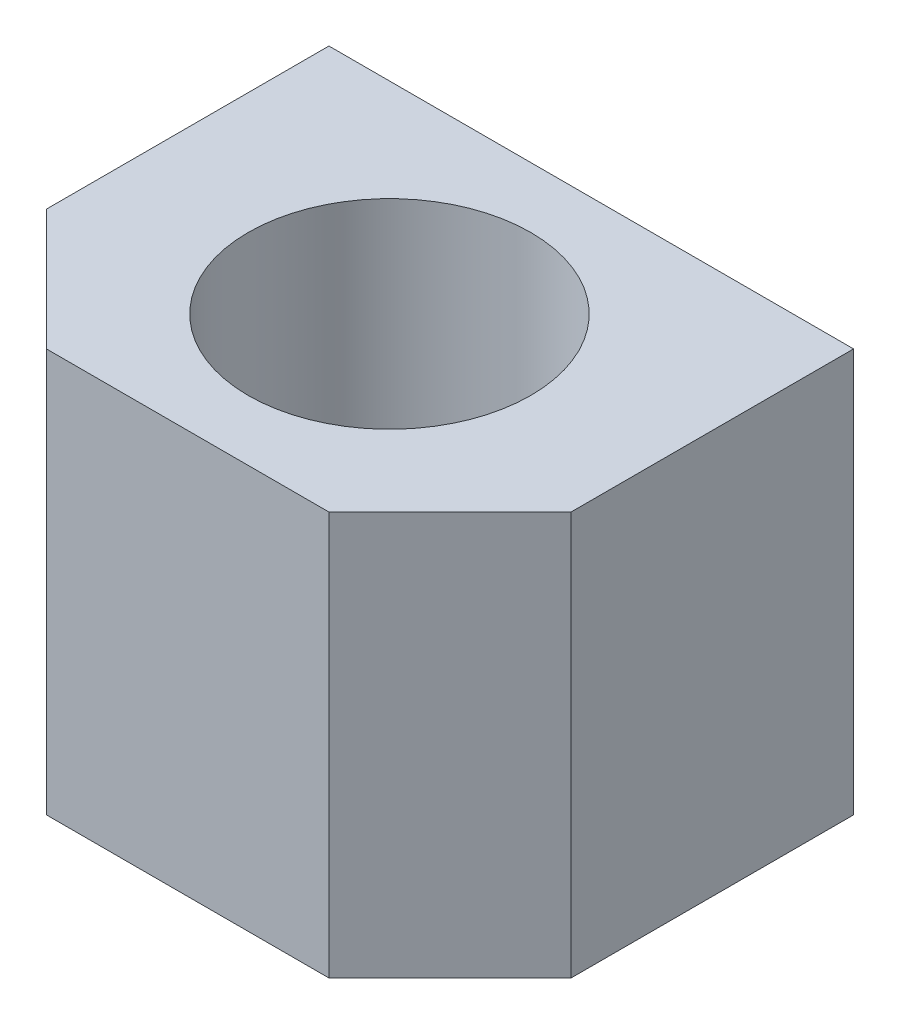
ISO-10303-21;
HEADER;
FILE_DESCRIPTION(('STEP AP214'),'2;1');
FILE_NAME('part.step','',(''),(''),'','','');
FILE_SCHEMA(('AUTOMOTIVE_DESIGN { 1 0 10303 214 1 1 1 1 }'));
ENDSEC;
DATA;
#1=APPLICATION_CONTEXT('core data for automotive mechanical design processes');
#2=APPLICATION_PROTOCOL_DEFINITION('international standard','automotive_design',2000,#1);
#3=PRODUCT_CONTEXT('',#1,'mechanical');
#4=PRODUCT('Part','Part','',(#3));
#5=PRODUCT_RELATED_PRODUCT_CATEGORY('part','',(#4));
#6=PRODUCT_DEFINITION_FORMATION('','',#4);
#7=PRODUCT_DEFINITION_CONTEXT('part definition',#1,'design');
#8=PRODUCT_DEFINITION('design','',#6,#7);
#9=PRODUCT_DEFINITION_SHAPE('','',#8);
#10=(LENGTH_UNIT() NAMED_UNIT(*) SI_UNIT(.MILLI.,.METRE.));
#11=(NAMED_UNIT(*) PLANE_ANGLE_UNIT() SI_UNIT($,.RADIAN.));
#12=(NAMED_UNIT(*) SI_UNIT($,.STERADIAN.) SOLID_ANGLE_UNIT());
#13=UNCERTAINTY_MEASURE_WITH_UNIT(LENGTH_MEASURE(1.E-05),#10,'distance_accuracy_value','');
#14=(GEOMETRIC_REPRESENTATION_CONTEXT(3) GLOBAL_UNCERTAINTY_ASSIGNED_CONTEXT((#13)) GLOBAL_UNIT_ASSIGNED_CONTEXT((#10,
#11,#12)) REPRESENTATION_CONTEXT('',''));
#15=CARTESIAN_POINT('',(0.,0.,0.));
#16=DIRECTION('',(0.,0.,1.));
#17=DIRECTION('',(1.,0.,0.));
#18=AXIS2_PLACEMENT_3D('',#15,#16,#17);
#19=CARTESIAN_POINT('',(0.,0.,0.));
#20=DIRECTION('',(0.,1.,0.));
#21=DIRECTION('',(1.,0.,0.));
#22=AXIS2_PLACEMENT_3D('',#19,#20,#21);
#23=PLANE('',#22);
#24=CARTESIAN_POINT('',(0.,0.,0.));
#25=DIRECTION('',(0.,-1.,0.));
#26=DIRECTION('',(1.,0.,0.));
#27=AXIS2_PLACEMENT_3D('',#24,#25,#26);
#28=CIRCLE('',#27,14.);
#29=CARTESIAN_POINT('',(-14.,0.,0.));
#30=VERTEX_POINT('',#29);
#31=EDGE_CURVE('E229',#30,#30,#28,.T.);
#32=ORIENTED_EDGE('',*,*,#31,.F.);
#33=EDGE_LOOP('',(#32));
#34=FACE_BOUND('',#33,.T.);
#35=CARTESIAN_POINT('',(-13.4965451986757,0.,-13.4965451986758));
#36=DIRECTION('',(0.,1.,0.));
#37=DIRECTION('',(0.,0.,-1.));
#38=AXIS2_PLACEMENT_3D('',#35,#36,#37);
#39=CIRCLE('',#38,2.117);
#40=CARTESIAN_POINT('',(-13.4965451986757,0.,-11.3795451986758));
#41=VERTEX_POINT('',#40);
#42=EDGE_CURVE('E207',#41,#41,#39,.T.);
#43=ORIENTED_EDGE('',*,*,#42,.T.);
#44=EDGE_LOOP('',(#43));
#45=FACE_BOUND('',#44,.T.);
#46=CARTESIAN_POINT('',(-13.4350288425444,0.,13.4350288425444));
#47=DIRECTION('',(0.,1.,0.));
#48=DIRECTION('',(0.,0.,-1.));
#49=AXIS2_PLACEMENT_3D('',#46,#47,#48);
#50=CIRCLE('',#49,2.117);
#51=CARTESIAN_POINT('',(-13.4350288425444,0.,15.5520288425444));
#52=VERTEX_POINT('',#51);
#53=EDGE_CURVE('E203',#52,#52,#50,.T.);
#54=ORIENTED_EDGE('',*,*,#53,.T.);
#55=EDGE_LOOP('',(#54));
#56=FACE_BOUND('',#55,.T.);
#57=CARTESIAN_POINT('',(-19.,0.,0.));
#58=DIRECTION('',(0.,1.,0.));
#59=DIRECTION('',(0.,0.,-1.));
#60=AXIS2_PLACEMENT_3D('',#57,#58,#59);
#61=CIRCLE('',#60,2.117);
#62=CARTESIAN_POINT('',(-19.,0.,2.117));
#63=VERTEX_POINT('',#62);
#64=EDGE_CURVE('E305',#63,#63,#61,.T.);
#65=ORIENTED_EDGE('',*,*,#64,.T.);
#66=EDGE_LOOP('',(#65));
#67=FACE_BOUND('',#66,.T.);
#68=CARTESIAN_POINT('',(13.4965451986757,0.,-13.4965451986758));
#69=DIRECTION('',(0.,1.,0.));
#70=DIRECTION('',(0.,0.,-1.));
#71=AXIS2_PLACEMENT_3D('',#68,#69,#70);
#72=CIRCLE('',#71,2.117);
#73=CARTESIAN_POINT('',(13.4965451986757,0.,-11.3795451986758));
#74=VERTEX_POINT('',#73);
#75=EDGE_CURVE('E327',#74,#74,#72,.T.);
#76=ORIENTED_EDGE('',*,*,#75,.T.);
#77=EDGE_LOOP('',(#76));
#78=FACE_BOUND('',#77,.T.);
#79=CARTESIAN_POINT('',(13.4350288425444,0.,13.4350288425444));
#80=DIRECTION('',(0.,1.,0.));
#81=DIRECTION('',(0.,0.,-1.));
#82=AXIS2_PLACEMENT_3D('',#79,#80,#81);
#83=CIRCLE('',#82,2.117);
#84=CARTESIAN_POINT('',(13.4350288425444,0.,15.5520288425444));
#85=VERTEX_POINT('',#84);
#86=EDGE_CURVE('E335',#85,#85,#83,.T.);
#87=ORIENTED_EDGE('',*,*,#86,.T.);
#88=EDGE_LOOP('',(#87));
#89=FACE_BOUND('',#88,.T.);
#90=CARTESIAN_POINT('',(19.,0.,0.));
#91=DIRECTION('',(0.,1.,0.));
#92=DIRECTION('',(0.,0.,-1.));
#93=AXIS2_PLACEMENT_3D('',#90,#91,#92);
#94=CIRCLE('',#93,2.117);
#95=CARTESIAN_POINT('',(19.,0.,2.117));
#96=VERTEX_POINT('',#95);
#97=EDGE_CURVE('E336',#96,#96,#94,.T.);
#98=ORIENTED_EDGE('',*,*,#97,.T.);
#99=EDGE_LOOP('',(#98));
#100=FACE_BOUND('',#99,.T.);
#101=DIRECTION('',(0.707106781186548,0.,-0.707106781186547));
#102=VECTOR('',#101,1.);
#103=CARTESIAN_POINT('',(14.,0.,20.));
#104=LINE('',#103,#102);
#105=CARTESIAN_POINT('',(14.,0.,20.));
#106=VERTEX_POINT('',#105);
#107=CARTESIAN_POINT('',(26.,0.,8.));
#108=VERTEX_POINT('',#107);
#109=EDGE_CURVE('E25',#106,#108,#104,.T.);
#110=ORIENTED_EDGE('',*,*,#109,.F.);
#111=DIRECTION('',(1.,0.,0.));
#112=VECTOR('',#111,1.);
#113=CARTESIAN_POINT('',(-26.,0.,20.));
#114=LINE('',#113,#112);
#115=CARTESIAN_POINT('',(-14.,0.,20.));
#116=VERTEX_POINT('',#115);
#117=EDGE_CURVE('E231',#116,#106,#114,.T.);
#118=ORIENTED_EDGE('',*,*,#117,.F.);
#119=DIRECTION('',(0.707106781186548,0.,0.707106781186547));
#120=VECTOR('',#119,1.);
#121=CARTESIAN_POINT('',(-26.,0.,8.));
#122=LINE('',#121,#120);
#123=CARTESIAN_POINT('',(-26.,0.,8.));
#124=VERTEX_POINT('',#123);
#125=EDGE_CURVE('E251',#124,#116,#122,.T.);
#126=ORIENTED_EDGE('',*,*,#125,.F.);
#127=DIRECTION('',(0.,0.,1.));
#128=VECTOR('',#127,1.);
#129=CARTESIAN_POINT('',(-26.,0.,-20.));
#130=LINE('',#129,#128);
#131=CARTESIAN_POINT('',(-26.,0.,-20.));
#132=VERTEX_POINT('',#131);
#133=EDGE_CURVE('E239',#132,#124,#130,.T.);
#134=ORIENTED_EDGE('',*,*,#133,.F.);
#135=DIRECTION('',(-1.,0.,0.));
#136=VECTOR('',#135,1.);
#137=CARTESIAN_POINT('',(26.,0.,-20.));
#138=LINE('',#137,#136);
#139=CARTESIAN_POINT('',(26.,0.,-20.));
#140=VERTEX_POINT('',#139);
#141=EDGE_CURVE('E270',#140,#132,#138,.T.);
#142=ORIENTED_EDGE('',*,*,#141,.F.);
#143=DIRECTION('',(0.,0.,-1.));
#144=VECTOR('',#143,1.);
#145=CARTESIAN_POINT('',(26.,0.,20.));
#146=LINE('',#145,#144);
#147=EDGE_CURVE('E280',#108,#140,#146,.T.);
#148=ORIENTED_EDGE('',*,*,#147,.F.);
#149=EDGE_LOOP('',(#110,#118,#126,#134,#142,#148));
#150=FACE_BOUND('',#149,.T.);
#151=ADVANCED_FACE('F17',(#34,#45,#56,#67,#78,#89,#100,#150),#23,.F.);
#152=CARTESIAN_POINT('',(0.,40.,0.));
#153=DIRECTION('',(0.,1.,0.));
#154=DIRECTION('',(1.,0.,0.));
#155=AXIS2_PLACEMENT_3D('',#152,#153,#154);
#156=PLANE('',#155);
#157=CARTESIAN_POINT('',(0.,40.,0.));
#158=DIRECTION('',(0.,-1.,0.));
#159=DIRECTION('',(1.,0.,0.));
#160=AXIS2_PLACEMENT_3D('',#157,#158,#159);
#161=CIRCLE('',#160,14.);
#162=CARTESIAN_POINT('',(-14.,40.,0.));
#163=VERTEX_POINT('',#162);
#164=EDGE_CURVE('E219',#163,#163,#161,.T.);
#165=ORIENTED_EDGE('',*,*,#164,.T.);
#166=EDGE_LOOP('',(#165));
#167=FACE_BOUND('',#166,.T.);
#168=DIRECTION('',(0.707106781186548,0.,-0.707106781186547));
#169=VECTOR('',#168,1.);
#170=CARTESIAN_POINT('',(14.,40.,20.));
#171=LINE('',#170,#169);
#172=CARTESIAN_POINT('',(14.,40.,20.));
#173=VERTEX_POINT('',#172);
#174=CARTESIAN_POINT('',(26.,40.,8.));
#175=VERTEX_POINT('',#174);
#176=EDGE_CURVE('E11',#173,#175,#171,.T.);
#177=ORIENTED_EDGE('',*,*,#176,.T.);
#178=DIRECTION('',(0.,0.,-1.));
#179=VECTOR('',#178,1.);
#180=CARTESIAN_POINT('',(26.,40.,20.));
#181=LINE('',#180,#179);
#182=CARTESIAN_POINT('',(26.,40.,-20.));
#183=VERTEX_POINT('',#182);
#184=EDGE_CURVE('E278',#175,#183,#181,.T.);
#185=ORIENTED_EDGE('',*,*,#184,.T.);
#186=DIRECTION('',(-1.,0.,0.));
#187=VECTOR('',#186,1.);
#188=CARTESIAN_POINT('',(26.,40.,-20.));
#189=LINE('',#188,#187);
#190=CARTESIAN_POINT('',(-26.,40.,-20.));
#191=VERTEX_POINT('',#190);
#192=EDGE_CURVE('E269',#183,#191,#189,.T.);
#193=ORIENTED_EDGE('',*,*,#192,.T.);
#194=DIRECTION('',(0.,0.,1.));
#195=VECTOR('',#194,1.);
#196=CARTESIAN_POINT('',(-26.,40.,-20.));
#197=LINE('',#196,#195);
#198=CARTESIAN_POINT('',(-26.,40.,8.));
#199=VERTEX_POINT('',#198);
#200=EDGE_CURVE('E257',#191,#199,#197,.T.);
#201=ORIENTED_EDGE('',*,*,#200,.T.);
#202=DIRECTION('',(0.707106781186548,0.,0.707106781186547));
#203=VECTOR('',#202,1.);
#204=CARTESIAN_POINT('',(-26.,40.,8.));
#205=LINE('',#204,#203);
#206=CARTESIAN_POINT('',(-14.,40.,20.));
#207=VERTEX_POINT('',#206);
#208=EDGE_CURVE('E241',#199,#207,#205,.T.);
#209=ORIENTED_EDGE('',*,*,#208,.T.);
#210=DIRECTION('',(1.,0.,0.));
#211=VECTOR('',#210,1.);
#212=CARTESIAN_POINT('',(-26.,40.,20.));
#213=LINE('',#212,#211);
#214=EDGE_CURVE('E244',#207,#173,#213,.T.);
#215=ORIENTED_EDGE('',*,*,#214,.T.);
#216=EDGE_LOOP('',(#177,#185,#193,#201,#209,#215));
#217=FACE_BOUND('',#216,.T.);
#218=ADVANCED_FACE('F323',(#167,#217),#156,.T.);
#219=CARTESIAN_POINT('',(14.,0.,20.));
#220=DIRECTION('',(0.707106781186547,0.,0.707106781186548));
#221=DIRECTION('',(0.,-1.,0.));
#222=AXIS2_PLACEMENT_3D('',#219,#220,#221);
#223=PLANE('',#222);
#224=ORIENTED_EDGE('',*,*,#109,.T.);
#225=DIRECTION('',(0.,1.,0.));
#226=VECTOR('',#225,1.);
#227=CARTESIAN_POINT('',(26.,0.,8.));
#228=LINE('',#227,#226);
#229=EDGE_CURVE('E282',#108,#175,#228,.T.);
#230=ORIENTED_EDGE('',*,*,#229,.T.);
#231=ORIENTED_EDGE('',*,*,#176,.F.);
#232=DIRECTION('',(0.,1.,0.));
#233=VECTOR('',#232,1.);
#234=CARTESIAN_POINT('',(14.,0.,20.));
#235=LINE('',#234,#233);
#236=EDGE_CURVE('E234',#106,#173,#235,.T.);
#237=ORIENTED_EDGE('',*,*,#236,.F.);
#238=EDGE_LOOP('',(#224,#230,#231,#237));
#239=FACE_BOUND('',#238,.T.);
#240=ADVANCED_FACE('F341',(#239),#223,.T.);
#241=CARTESIAN_POINT('',(26.,0.,8.));
#242=DIRECTION('',(1.,0.,0.));
#243=DIRECTION('',(0.,1.,0.));
#244=AXIS2_PLACEMENT_3D('',#241,#242,#243);
#245=PLANE('',#244);
#246=ORIENTED_EDGE('',*,*,#147,.T.);
#247=DIRECTION('',(0.,1.,0.));
#248=VECTOR('',#247,1.);
#249=CARTESIAN_POINT('',(26.,0.,-20.));
#250=LINE('',#249,#248);
#251=EDGE_CURVE('E272',#140,#183,#250,.T.);
#252=ORIENTED_EDGE('',*,*,#251,.T.);
#253=ORIENTED_EDGE('',*,*,#184,.F.);
#254=ORIENTED_EDGE('',*,*,#229,.F.);
#255=EDGE_LOOP('',(#246,#252,#253,#254));
#256=FACE_BOUND('',#255,.T.);
#257=ADVANCED_FACE('F359',(#256),#245,.T.);
#258=CARTESIAN_POINT('',(26.,0.,-20.));
#259=DIRECTION('',(0.,0.,-1.));
#260=DIRECTION('',(0.,-1.,0.));
#261=AXIS2_PLACEMENT_3D('',#258,#259,#260);
#262=PLANE('',#261);
#263=CARTESIAN_POINT('',(20.,8.,-20.));
#264=DIRECTION('',(0.,0.,1.));
#265=DIRECTION('',(-1.,0.,0.));
#266=AXIS2_PLACEMENT_3D('',#263,#264,#265);
#267=CIRCLE('',#266,2.117);
#268=CARTESIAN_POINT('',(22.117,8.,-20.));
#269=VERTEX_POINT('',#268);
#270=EDGE_CURVE('E667',#269,#269,#267,.T.);
#271=ORIENTED_EDGE('',*,*,#270,.T.);
#272=EDGE_LOOP('',(#271));
#273=FACE_BOUND('',#272,.T.);
#274=CARTESIAN_POINT('',(-20.,32.,-20.));
#275=DIRECTION('',(0.,0.,1.));
#276=DIRECTION('',(-1.,0.,0.));
#277=AXIS2_PLACEMENT_3D('',#274,#275,#276);
#278=CIRCLE('',#277,2.117);
#279=CARTESIAN_POINT('',(-17.883,32.,-20.));
#280=VERTEX_POINT('',#279);
#281=EDGE_CURVE('E672',#280,#280,#278,.T.);
#282=ORIENTED_EDGE('',*,*,#281,.T.);
#283=EDGE_LOOP('',(#282));
#284=FACE_BOUND('',#283,.T.);
#285=CARTESIAN_POINT('',(-20.,8.,-20.));
#286=DIRECTION('',(0.,0.,1.));
#287=DIRECTION('',(-1.,0.,0.));
#288=AXIS2_PLACEMENT_3D('',#285,#286,#287);
#289=CIRCLE('',#288,2.117);
#290=CARTESIAN_POINT('',(-17.883,8.,-20.));
#291=VERTEX_POINT('',#290);
#292=EDGE_CURVE('E653',#291,#291,#289,.T.);
#293=ORIENTED_EDGE('',*,*,#292,.T.);
#294=EDGE_LOOP('',(#293));
#295=FACE_BOUND('',#294,.T.);
#296=CARTESIAN_POINT('',(20.,32.,-20.));
#297=DIRECTION('',(0.,0.,1.));
#298=DIRECTION('',(-1.,0.,0.));
#299=AXIS2_PLACEMENT_3D('',#296,#297,#298);
#300=CIRCLE('',#299,2.117);
#301=CARTESIAN_POINT('',(22.117,32.,-20.));
#302=VERTEX_POINT('',#301);
#303=EDGE_CURVE('E639',#302,#302,#300,.T.);
#304=ORIENTED_EDGE('',*,*,#303,.T.);
#305=EDGE_LOOP('',(#304));
#306=FACE_BOUND('',#305,.T.);
#307=ORIENTED_EDGE('',*,*,#141,.T.);
#308=DIRECTION('',(0.,1.,0.));
#309=VECTOR('',#308,1.);
#310=CARTESIAN_POINT('',(-26.,0.,-20.));
#311=LINE('',#310,#309);
#312=EDGE_CURVE('E263',#132,#191,#311,.T.);
#313=ORIENTED_EDGE('',*,*,#312,.T.);
#314=ORIENTED_EDGE('',*,*,#192,.F.);
#315=ORIENTED_EDGE('',*,*,#251,.F.);
#316=EDGE_LOOP('',(#307,#313,#314,#315));
#317=FACE_BOUND('',#316,.T.);
#318=ADVANCED_FACE('F360',(#273,#284,#295,#306,#317),#262,.T.);
#319=CARTESIAN_POINT('',(-26.,0.,-20.));
#320=DIRECTION('',(-1.,0.,0.));
#321=DIRECTION('',(0.,0.,1.));
#322=AXIS2_PLACEMENT_3D('',#319,#320,#321);
#323=PLANE('',#322);
#324=ORIENTED_EDGE('',*,*,#133,.T.);
#325=DIRECTION('',(0.,1.,0.));
#326=VECTOR('',#325,1.);
#327=CARTESIAN_POINT('',(-26.,0.,8.));
#328=LINE('',#327,#326);
#329=EDGE_CURVE('E240',#124,#199,#328,.T.);
#330=ORIENTED_EDGE('',*,*,#329,.T.);
#331=ORIENTED_EDGE('',*,*,#200,.F.);
#332=ORIENTED_EDGE('',*,*,#312,.F.);
#333=EDGE_LOOP('',(#324,#330,#331,#332));
#334=FACE_BOUND('',#333,.T.);
#335=ADVANCED_FACE('F352',(#334),#323,.T.);
#336=CARTESIAN_POINT('',(-26.,0.,8.));
#337=DIRECTION('',(-0.707106781186547,0.,0.707106781186548));
#338=DIRECTION('',(0.,1.,0.));
#339=AXIS2_PLACEMENT_3D('',#336,#337,#338);
#340=PLANE('',#339);
#341=ORIENTED_EDGE('',*,*,#125,.T.);
#342=DIRECTION('',(0.,1.,0.));
#343=VECTOR('',#342,1.);
#344=CARTESIAN_POINT('',(-14.,0.,20.));
#345=LINE('',#344,#343);
#346=EDGE_CURVE('E247',#116,#207,#345,.T.);
#347=ORIENTED_EDGE('',*,*,#346,.T.);
#348=ORIENTED_EDGE('',*,*,#208,.F.);
#349=ORIENTED_EDGE('',*,*,#329,.F.);
#350=EDGE_LOOP('',(#341,#347,#348,#349));
#351=FACE_BOUND('',#350,.T.);
#352=ADVANCED_FACE('F348',(#351),#340,.T.);
#353=CARTESIAN_POINT('',(-14.,0.,20.));
#354=DIRECTION('',(0.,0.,1.));
#355=DIRECTION('',(1.,0.,0.));
#356=AXIS2_PLACEMENT_3D('',#353,#354,#355);
#357=PLANE('',#356);
#358=ORIENTED_EDGE('',*,*,#117,.T.);
#359=ORIENTED_EDGE('',*,*,#236,.T.);
#360=ORIENTED_EDGE('',*,*,#214,.F.);
#361=ORIENTED_EDGE('',*,*,#346,.F.);
#362=EDGE_LOOP('',(#358,#359,#360,#361));
#363=FACE_BOUND('',#362,.T.);
#364=ADVANCED_FACE('F344',(#363),#357,.T.);
#365=CARTESIAN_POINT('',(0.,0.,0.));
#366=DIRECTION('',(0.,1.,0.));
#367=DIRECTION('',(1.,0.,0.));
#368=AXIS2_PLACEMENT_3D('',#365,#366,#367);
#369=CYLINDRICAL_SURFACE('',#368,14.);
#370=ORIENTED_EDGE('',*,*,#164,.F.);
#371=DIRECTION('',(0.,-1.,0.));
#372=VECTOR('',#371,1.);
#373=CARTESIAN_POINT('',(-14.,0.,0.));
#374=LINE('',#373,#372);
#375=EDGE_CURVE('E221',#163,#30,#374,.T.);
#376=ORIENTED_EDGE('',*,*,#375,.T.);
#377=ORIENTED_EDGE('',*,*,#31,.T.);
#378=ORIENTED_EDGE('',*,*,#375,.F.);
#379=EDGE_LOOP('',(#370,#376,#377,#378));
#380=FACE_BOUND('',#379,.T.);
#381=ADVANCED_FACE('F372',(#380),#369,.F.);
#382=CARTESIAN_POINT('',(-13.4965451986757,10.,-13.4965451986758));
#383=DIRECTION('',(0.,1.,0.));
#384=DIRECTION('',(0.,0.,-1.));
#385=AXIS2_PLACEMENT_3D('',#382,#383,#384);
#386=CYLINDRICAL_SURFACE('',#385,2.117);
#387=ORIENTED_EDGE('',*,*,#42,.F.);
#388=DIRECTION('',(0.,1.,0.));
#389=VECTOR('',#388,1.);
#390=CARTESIAN_POINT('',(-13.4965451986757,10.,-11.3795451986758));
#391=LINE('',#390,#389);
#392=CARTESIAN_POINT('',(-13.4965451986757,20.,-11.3795451986758));
#393=VERTEX_POINT('',#392);
#394=EDGE_CURVE('E220',#41,#393,#391,.T.);
#395=ORIENTED_EDGE('',*,*,#394,.T.);
#396=CARTESIAN_POINT('',(-13.4965451986757,20.,-13.4965451986758));
#397=DIRECTION('',(0.,1.,0.));
#398=DIRECTION('',(0.,0.,-1.));
#399=AXIS2_PLACEMENT_3D('',#396,#397,#398);
#400=CIRCLE('',#399,2.117);
#401=EDGE_CURVE('E201',#393,#393,#400,.T.);
#402=ORIENTED_EDGE('',*,*,#401,.T.);
#403=ORIENTED_EDGE('',*,*,#394,.F.);
#404=EDGE_LOOP('',(#387,#395,#402,#403));
#405=FACE_BOUND('',#404,.T.);
#406=ADVANCED_FACE('F375',(#405),#386,.F.);
#407=CARTESIAN_POINT('',(-13.4965451986757,20.6360109652407,-13.4965451986758));
#408=DIRECTION('',(0.,-1.,0.));
#409=DIRECTION('',(0.,0.,-1.));
#410=AXIS2_PLACEMENT_3D('',#407,#408,#409);
#411=CONICAL_SURFACE('',#410,1.0585,1.02974425867665);
#412=CARTESIAN_POINT('',(-13.4965451986757,21.2720219304814,-13.4965451986758));
#413=VERTEX_POINT('',#412);
#414=VERTEX_LOOP('',#413);
#415=FACE_BOUND('',#414,.T.);
#416=ORIENTED_EDGE('',*,*,#401,.F.);
#417=EDGE_LOOP('',(#416));
#418=FACE_BOUND('',#417,.T.);
#419=ADVANCED_FACE('F427',(#415,#418),#411,.F.);
#420=CARTESIAN_POINT('',(-13.4350288425444,10.,13.4350288425444));
#421=DIRECTION('',(0.,1.,0.));
#422=DIRECTION('',(0.,0.,-1.));
#423=AXIS2_PLACEMENT_3D('',#420,#421,#422);
#424=CYLINDRICAL_SURFACE('',#423,2.117);
#425=ORIENTED_EDGE('',*,*,#53,.F.);
#426=DIRECTION('',(0.,1.,0.));
#427=VECTOR('',#426,1.);
#428=CARTESIAN_POINT('',(-13.4350288425444,10.,15.5520288425444));
#429=LINE('',#428,#427);
#430=CARTESIAN_POINT('',(-13.4350288425444,20.,15.5520288425444));
#431=VERTEX_POINT('',#430);
#432=EDGE_CURVE('E198',#52,#431,#429,.T.);
#433=ORIENTED_EDGE('',*,*,#432,.T.);
#434=CARTESIAN_POINT('',(-13.4350288425444,20.,13.4350288425444));
#435=DIRECTION('',(0.,1.,0.));
#436=DIRECTION('',(0.,0.,-1.));
#437=AXIS2_PLACEMENT_3D('',#434,#435,#436);
#438=CIRCLE('',#437,2.117);
#439=EDGE_CURVE('E200',#431,#431,#438,.T.);
#440=ORIENTED_EDGE('',*,*,#439,.T.);
#441=ORIENTED_EDGE('',*,*,#432,.F.);
#442=EDGE_LOOP('',(#425,#433,#440,#441));
#443=FACE_BOUND('',#442,.T.);
#444=ADVANCED_FACE('F197',(#443),#424,.F.);
#445=CARTESIAN_POINT('',(-13.4350288425444,20.6360109652407,13.4350288425444));
#446=DIRECTION('',(0.,-1.,0.));
#447=DIRECTION('',(0.,0.,-1.));
#448=AXIS2_PLACEMENT_3D('',#445,#446,#447);
#449=CONICAL_SURFACE('',#448,1.0585,1.02974425867665);
#450=CARTESIAN_POINT('',(-13.4350288425444,21.2720219304814,13.4350288425444));
#451=VERTEX_POINT('',#450);
#452=VERTEX_LOOP('',#451);
#453=FACE_BOUND('',#452,.T.);
#454=ORIENTED_EDGE('',*,*,#439,.F.);
#455=EDGE_LOOP('',(#454));
#456=FACE_BOUND('',#455,.T.);
#457=ADVANCED_FACE('F441',(#453,#456),#449,.F.);
#458=CARTESIAN_POINT('',(-19.,10.,0.));
#459=DIRECTION('',(0.,1.,0.));
#460=DIRECTION('',(0.,0.,-1.));
#461=AXIS2_PLACEMENT_3D('',#458,#459,#460);
#462=CYLINDRICAL_SURFACE('',#461,2.117);
#463=ORIENTED_EDGE('',*,*,#64,.F.);
#464=DIRECTION('',(0.,1.,0.));
#465=VECTOR('',#464,1.);
#466=CARTESIAN_POINT('',(-19.,10.,2.117));
#467=LINE('',#466,#465);
#468=CARTESIAN_POINT('',(-19.,20.,2.117));
#469=VERTEX_POINT('',#468);
#470=EDGE_CURVE('E308',#63,#469,#467,.T.);
#471=ORIENTED_EDGE('',*,*,#470,.T.);
#472=CARTESIAN_POINT('',(-19.,20.,0.));
#473=DIRECTION('',(0.,1.,0.));
#474=DIRECTION('',(0.,0.,-1.));
#475=AXIS2_PLACEMENT_3D('',#472,#473,#474);
#476=CIRCLE('',#475,2.117);
#477=EDGE_CURVE('E298',#469,#469,#476,.T.);
#478=ORIENTED_EDGE('',*,*,#477,.T.);
#479=ORIENTED_EDGE('',*,*,#470,.F.);
#480=EDGE_LOOP('',(#463,#471,#478,#479));
#481=FACE_BOUND('',#480,.T.);
#482=ADVANCED_FACE('F318',(#481),#462,.F.);
#483=CARTESIAN_POINT('',(-19.,20.6360109652407,0.));
#484=DIRECTION('',(0.,-1.,0.));
#485=DIRECTION('',(0.,0.,-1.));
#486=AXIS2_PLACEMENT_3D('',#483,#484,#485);
#487=CONICAL_SURFACE('',#486,1.0585,1.02974425867665);
#488=CARTESIAN_POINT('',(-19.,21.2720219304814,0.));
#489=VERTEX_POINT('',#488);
#490=VERTEX_LOOP('',#489);
#491=FACE_BOUND('',#490,.T.);
#492=ORIENTED_EDGE('',*,*,#477,.F.);
#493=EDGE_LOOP('',(#492));
#494=FACE_BOUND('',#493,.T.);
#495=ADVANCED_FACE('F461',(#491,#494),#487,.F.);
#496=CARTESIAN_POINT('',(13.4965451986757,10.,-13.4965451986758));
#497=DIRECTION('',(0.,-1.,0.));
#498=DIRECTION('',(0.,0.,-1.));
#499=AXIS2_PLACEMENT_3D('',#496,#497,#498);
#500=CYLINDRICAL_SURFACE('',#499,2.117);
#501=ORIENTED_EDGE('',*,*,#75,.F.);
#502=DIRECTION('',(0.,1.,0.));
#503=VECTOR('',#502,1.);
#504=CARTESIAN_POINT('',(13.4965451986757,10.,-11.3795451986758));
#505=LINE('',#504,#503);
#506=CARTESIAN_POINT('',(13.4965451986757,20.,-11.3795451986758));
#507=VERTEX_POINT('',#506);
#508=EDGE_CURVE('E300',#74,#507,#505,.T.);
#509=ORIENTED_EDGE('',*,*,#508,.T.);
#510=CARTESIAN_POINT('',(13.4965451986757,20.,-13.4965451986758));
#511=DIRECTION('',(0.,-1.,0.));
#512=DIRECTION('',(0.,0.,-1.));
#513=AXIS2_PLACEMENT_3D('',#510,#511,#512);
#514=CIRCLE('',#513,2.117);
#515=EDGE_CURVE('E697',#507,#507,#514,.T.);
#516=ORIENTED_EDGE('',*,*,#515,.F.);
#517=ORIENTED_EDGE('',*,*,#508,.F.);
#518=EDGE_LOOP('',(#501,#509,#516,#517));
#519=FACE_BOUND('',#518,.T.);
#520=ADVANCED_FACE('F473',(#519),#500,.F.);
#521=CARTESIAN_POINT('',(13.4965451986757,20.6360109652407,-13.4965451986758));
#522=DIRECTION('',(0.,-1.,0.));
#523=DIRECTION('',(0.,0.,-1.));
#524=AXIS2_PLACEMENT_3D('',#521,#522,#523);
#525=CONICAL_SURFACE('',#524,1.0585,1.02974425867665);
#526=CARTESIAN_POINT('',(13.4965451986757,21.2720219304814,-13.4965451986758));
#527=VERTEX_POINT('',#526);
#528=VERTEX_LOOP('',#527);
#529=FACE_BOUND('',#528,.T.);
#530=ORIENTED_EDGE('',*,*,#515,.T.);
#531=EDGE_LOOP('',(#530));
#532=FACE_BOUND('',#531,.T.);
#533=ADVANCED_FACE('F481',(#529,#532),#525,.F.);
#534=CARTESIAN_POINT('',(13.4350288425444,10.,13.4350288425444));
#535=DIRECTION('',(0.,-1.,0.));
#536=DIRECTION('',(0.,0.,-1.));
#537=AXIS2_PLACEMENT_3D('',#534,#535,#536);
#538=CYLINDRICAL_SURFACE('',#537,2.117);
#539=ORIENTED_EDGE('',*,*,#86,.F.);
#540=DIRECTION('',(0.,1.,0.));
#541=VECTOR('',#540,1.);
#542=CARTESIAN_POINT('',(13.4350288425444,10.,15.5520288425444));
#543=LINE('',#542,#541);
#544=CARTESIAN_POINT('',(13.4350288425444,20.,15.5520288425444));
#545=VERTEX_POINT('',#544);
#546=EDGE_CURVE('E700',#85,#545,#543,.T.);
#547=ORIENTED_EDGE('',*,*,#546,.T.);
#548=CARTESIAN_POINT('',(13.4350288425444,20.,13.4350288425444));
#549=DIRECTION('',(0.,-1.,0.));
#550=DIRECTION('',(0.,0.,-1.));
#551=AXIS2_PLACEMENT_3D('',#548,#549,#550);
#552=CIRCLE('',#551,2.117);
#553=EDGE_CURVE('E693',#545,#545,#552,.T.);
#554=ORIENTED_EDGE('',*,*,#553,.F.);
#555=ORIENTED_EDGE('',*,*,#546,.F.);
#556=EDGE_LOOP('',(#539,#547,#554,#555));
#557=FACE_BOUND('',#556,.T.);
#558=ADVANCED_FACE('F489',(#557),#538,.F.);
#559=CARTESIAN_POINT('',(13.4350288425444,20.6360109652407,13.4350288425444));
#560=DIRECTION('',(0.,-1.,0.));
#561=DIRECTION('',(0.,0.,-1.));
#562=AXIS2_PLACEMENT_3D('',#559,#560,#561);
#563=CONICAL_SURFACE('',#562,1.0585,1.02974425867665);
#564=CARTESIAN_POINT('',(13.4350288425444,21.2720219304814,13.4350288425444));
#565=VERTEX_POINT('',#564);
#566=VERTEX_LOOP('',#565);
#567=FACE_BOUND('',#566,.T.);
#568=ORIENTED_EDGE('',*,*,#553,.T.);
#569=EDGE_LOOP('',(#568));
#570=FACE_BOUND('',#569,.T.);
#571=ADVANCED_FACE('F496',(#567,#570),#563,.F.);
#572=CARTESIAN_POINT('',(19.,10.,0.));
#573=DIRECTION('',(0.,-1.,0.));
#574=DIRECTION('',(0.,0.,-1.));
#575=AXIS2_PLACEMENT_3D('',#572,#573,#574);
#576=CYLINDRICAL_SURFACE('',#575,2.117);
#577=ORIENTED_EDGE('',*,*,#97,.F.);
#578=DIRECTION('',(0.,1.,0.));
#579=VECTOR('',#578,1.);
#580=CARTESIAN_POINT('',(19.,10.,2.117));
#581=LINE('',#580,#579);
#582=CARTESIAN_POINT('',(19.,20.,2.117));
#583=VERTEX_POINT('',#582);
#584=EDGE_CURVE('E676',#96,#583,#581,.T.);
#585=ORIENTED_EDGE('',*,*,#584,.T.);
#586=CARTESIAN_POINT('',(19.,20.,0.));
#587=DIRECTION('',(0.,-1.,0.));
#588=DIRECTION('',(0.,0.,-1.));
#589=AXIS2_PLACEMENT_3D('',#586,#587,#588);
#590=CIRCLE('',#589,2.117);
#591=EDGE_CURVE('E678',#583,#583,#590,.T.);
#592=ORIENTED_EDGE('',*,*,#591,.F.);
#593=ORIENTED_EDGE('',*,*,#584,.F.);
#594=EDGE_LOOP('',(#577,#585,#592,#593));
#595=FACE_BOUND('',#594,.T.);
#596=ADVANCED_FACE('F510',(#595),#576,.F.);
#597=CARTESIAN_POINT('',(19.,20.6360109652407,0.));
#598=DIRECTION('',(0.,-1.,0.));
#599=DIRECTION('',(0.,0.,-1.));
#600=AXIS2_PLACEMENT_3D('',#597,#598,#599);
#601=CONICAL_SURFACE('',#600,1.0585,1.02974425867665);
#602=CARTESIAN_POINT('',(19.,21.2720219304814,0.));
#603=VERTEX_POINT('',#602);
#604=VERTEX_LOOP('',#603);
#605=FACE_BOUND('',#604,.T.);
#606=ORIENTED_EDGE('',*,*,#591,.T.);
#607=EDGE_LOOP('',(#606));
#608=FACE_BOUND('',#607,.T.);
#609=ADVANCED_FACE('F516',(#605,#608),#601,.F.);
#610=CARTESIAN_POINT('',(20.,8.,-12.5));
#611=DIRECTION('',(0.,0.,1.));
#612=DIRECTION('',(-1.,0.,0.));
#613=AXIS2_PLACEMENT_3D('',#610,#611,#612);
#614=CYLINDRICAL_SURFACE('',#613,2.117);
#615=ORIENTED_EDGE('',*,*,#270,.F.);
#616=DIRECTION('',(0.,0.,1.));
#617=VECTOR('',#616,1.);
#618=CARTESIAN_POINT('',(22.117,8.,-12.5));
#619=LINE('',#618,#617);
#620=CARTESIAN_POINT('',(22.117,8.,-5.));
#621=VERTEX_POINT('',#620);
#622=EDGE_CURVE('E684',#269,#621,#619,.T.);
#623=ORIENTED_EDGE('',*,*,#622,.T.);
#624=CARTESIAN_POINT('',(20.,8.,-5.));
#625=DIRECTION('',(0.,0.,1.));
#626=DIRECTION('',(-1.,0.,0.));
#627=AXIS2_PLACEMENT_3D('',#624,#625,#626);
#628=CIRCLE('',#627,2.117);
#629=EDGE_CURVE('E664',#621,#621,#628,.T.);
#630=ORIENTED_EDGE('',*,*,#629,.T.);
#631=ORIENTED_EDGE('',*,*,#622,.F.);
#632=EDGE_LOOP('',(#615,#623,#630,#631));
#633=FACE_BOUND('',#632,.T.);
#634=ADVANCED_FACE('F528',(#633),#614,.F.);
#635=CARTESIAN_POINT('',(20.,8.,-4.36398903475933));
#636=DIRECTION('',(0.,0.,-1.));
#637=DIRECTION('',(-1.,0.,0.));
#638=AXIS2_PLACEMENT_3D('',#635,#636,#637);
#639=CONICAL_SURFACE('',#638,1.0585,1.02974425867665);
#640=CARTESIAN_POINT('',(20.,8.,-3.72797806951865));
#641=VERTEX_POINT('',#640);
#642=VERTEX_LOOP('',#641);
#643=FACE_BOUND('',#642,.T.);
#644=ORIENTED_EDGE('',*,*,#629,.F.);
#645=EDGE_LOOP('',(#644));
#646=FACE_BOUND('',#645,.T.);
#647=ADVANCED_FACE('F532',(#643,#646),#639,.F.);
#648=CARTESIAN_POINT('',(-20.,32.,-12.5));
#649=DIRECTION('',(0.,0.,1.));
#650=DIRECTION('',(-1.,0.,0.));
#651=AXIS2_PLACEMENT_3D('',#648,#649,#650);
#652=CYLINDRICAL_SURFACE('',#651,2.117);
#653=ORIENTED_EDGE('',*,*,#281,.F.);
#654=DIRECTION('',(0.,0.,1.));
#655=VECTOR('',#654,1.);
#656=CARTESIAN_POINT('',(-17.883,32.,-12.5));
#657=LINE('',#656,#655);
#658=CARTESIAN_POINT('',(-17.883,32.,-5.));
#659=VERTEX_POINT('',#658);
#660=EDGE_CURVE('E651',#280,#659,#657,.T.);
#661=ORIENTED_EDGE('',*,*,#660,.T.);
#662=CARTESIAN_POINT('',(-20.,32.,-5.));
#663=DIRECTION('',(0.,0.,1.));
#664=DIRECTION('',(-1.,0.,0.));
#665=AXIS2_PLACEMENT_3D('',#662,#663,#664);
#666=CIRCLE('',#665,2.117);
#667=EDGE_CURVE('E670',#659,#659,#666,.T.);
#668=ORIENTED_EDGE('',*,*,#667,.T.);
#669=ORIENTED_EDGE('',*,*,#660,.F.);
#670=EDGE_LOOP('',(#653,#661,#668,#669));
#671=FACE_BOUND('',#670,.T.);
#672=ADVANCED_FACE('F543',(#671),#652,.F.);
#673=CARTESIAN_POINT('',(-20.,32.,-4.36398903475933));
#674=DIRECTION('',(0.,0.,-1.));
#675=DIRECTION('',(-1.,0.,0.));
#676=AXIS2_PLACEMENT_3D('',#673,#674,#675);
#677=CONICAL_SURFACE('',#676,1.0585,1.02974425867665);
#678=CARTESIAN_POINT('',(-20.,32.,-3.72797806951865));
#679=VERTEX_POINT('',#678);
#680=VERTEX_LOOP('',#679);
#681=FACE_BOUND('',#680,.T.);
#682=ORIENTED_EDGE('',*,*,#667,.F.);
#683=EDGE_LOOP('',(#682));
#684=FACE_BOUND('',#683,.T.);
#685=ADVANCED_FACE('F552',(#681,#684),#677,.F.);
#686=CARTESIAN_POINT('',(-20.,8.,-12.5));
#687=DIRECTION('',(0.,0.,1.));
#688=DIRECTION('',(-1.,0.,0.));
#689=AXIS2_PLACEMENT_3D('',#686,#687,#688);
#690=CYLINDRICAL_SURFACE('',#689,2.117);
#691=ORIENTED_EDGE('',*,*,#292,.F.);
#692=DIRECTION('',(0.,0.,1.));
#693=VECTOR('',#692,1.);
#694=CARTESIAN_POINT('',(-17.883,8.,-12.5));
#695=LINE('',#694,#693);
#696=CARTESIAN_POINT('',(-17.883,8.,-5.));
#697=VERTEX_POINT('',#696);
#698=EDGE_CURVE('E654',#291,#697,#695,.T.);
#699=ORIENTED_EDGE('',*,*,#698,.T.);
#700=CARTESIAN_POINT('',(-20.,8.,-5.));
#701=DIRECTION('',(0.,0.,1.));
#702=DIRECTION('',(-1.,0.,0.));
#703=AXIS2_PLACEMENT_3D('',#700,#701,#702);
#704=CIRCLE('',#703,2.117);
#705=EDGE_CURVE('E656',#697,#697,#704,.T.);
#706=ORIENTED_EDGE('',*,*,#705,.T.);
#707=ORIENTED_EDGE('',*,*,#698,.F.);
#708=EDGE_LOOP('',(#691,#699,#706,#707));
#709=FACE_BOUND('',#708,.T.);
#710=ADVANCED_FACE('F558',(#709),#690,.F.);
#711=CARTESIAN_POINT('',(-20.,8.,-4.36398903475933));
#712=DIRECTION('',(0.,0.,-1.));
#713=DIRECTION('',(-1.,0.,0.));
#714=AXIS2_PLACEMENT_3D('',#711,#712,#713);
#715=CONICAL_SURFACE('',#714,1.0585,1.02974425867665);
#716=CARTESIAN_POINT('',(-20.,8.,-3.72797806951865));
#717=VERTEX_POINT('',#716);
#718=VERTEX_LOOP('',#717);
#719=FACE_BOUND('',#718,.T.);
#720=ORIENTED_EDGE('',*,*,#705,.F.);
#721=EDGE_LOOP('',(#720));
#722=FACE_BOUND('',#721,.T.);
#723=ADVANCED_FACE('F568',(#719,#722),#715,.F.);
#724=CARTESIAN_POINT('',(20.,32.,-12.5));
#725=DIRECTION('',(0.,0.,1.));
#726=DIRECTION('',(-1.,0.,0.));
#727=AXIS2_PLACEMENT_3D('',#724,#725,#726);
#728=CYLINDRICAL_SURFACE('',#727,2.117);
#729=ORIENTED_EDGE('',*,*,#303,.F.);
#730=DIRECTION('',(0.,0.,1.));
#731=VECTOR('',#730,1.);
#732=CARTESIAN_POINT('',(22.117,32.,-12.5));
#733=LINE('',#732,#731);
#734=CARTESIAN_POINT('',(22.117,32.,-5.));
#735=VERTEX_POINT('',#734);
#736=EDGE_CURVE('E650',#302,#735,#733,.T.);
#737=ORIENTED_EDGE('',*,*,#736,.T.);
#738=CARTESIAN_POINT('',(20.,32.,-5.));
#739=DIRECTION('',(0.,0.,1.));
#740=DIRECTION('',(-1.,0.,0.));
#741=AXIS2_PLACEMENT_3D('',#738,#739,#740);
#742=CIRCLE('',#741,2.117);
#743=EDGE_CURVE('E636',#735,#735,#742,.T.);
#744=ORIENTED_EDGE('',*,*,#743,.T.);
#745=ORIENTED_EDGE('',*,*,#736,.F.);
#746=EDGE_LOOP('',(#729,#737,#744,#745));
#747=FACE_BOUND('',#746,.T.);
#748=ADVANCED_FACE('F576',(#747),#728,.F.);
#749=CARTESIAN_POINT('',(20.,32.,-4.36398903475933));
#750=DIRECTION('',(0.,0.,-1.));
#751=DIRECTION('',(-1.,0.,0.));
#752=AXIS2_PLACEMENT_3D('',#749,#750,#751);
#753=CONICAL_SURFACE('',#752,1.0585,1.02974425867665);
#754=CARTESIAN_POINT('',(20.,32.,-3.72797806951865));
#755=VERTEX_POINT('',#754);
#756=VERTEX_LOOP('',#755);
#757=FACE_BOUND('',#756,.T.);
#758=ORIENTED_EDGE('',*,*,#743,.F.);
#759=EDGE_LOOP('',(#758));
#760=FACE_BOUND('',#759,.T.);
#761=ADVANCED_FACE('F585',(#757,#760),#753,.F.);
#762=CLOSED_SHELL('',(#151,#218,#240,#257,#318,#335,#352,#364,#381,#406,#419,#444,#457,#482,
#495,#520,#533,#558,#571,#596,#609,#634,#647,#672,#685,#710,#723,#748,#761));
#763=MANIFOLD_SOLID_BREP('B1',#762);
#764=ADVANCED_BREP_SHAPE_REPRESENTATION('',(#18,#763),#14);
#765=SHAPE_DEFINITION_REPRESENTATION(#9,#764);
ENDSEC;
END-ISO-10303-21;
